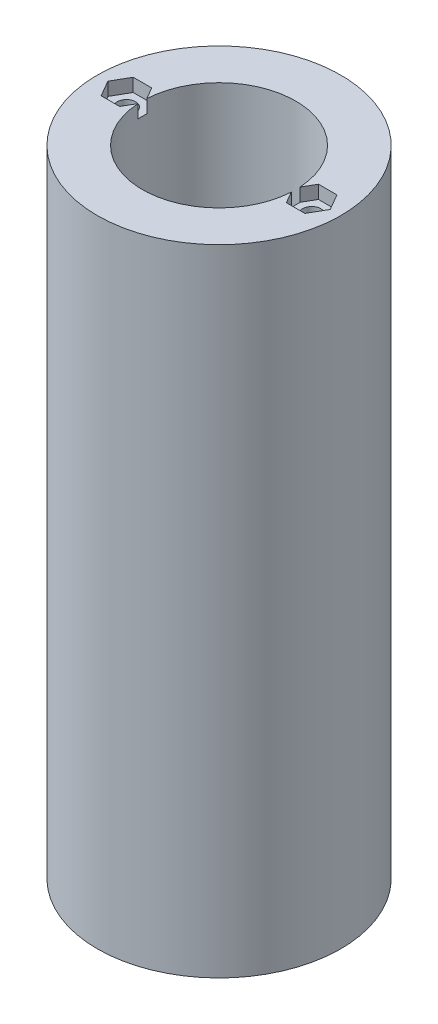
ISO-10303-21;
HEADER;
FILE_DESCRIPTION(('STEP AP214'),'2;1');
FILE_NAME('part.step','',(''),(''),'','','');
FILE_SCHEMA(('AUTOMOTIVE_DESIGN { 1 0 10303 214 1 1 1 1 }'));
ENDSEC;
DATA;
#1=APPLICATION_CONTEXT('core data for automotive mechanical design processes');
#2=APPLICATION_PROTOCOL_DEFINITION('international standard','automotive_design',2000,#1);
#3=PRODUCT_CONTEXT('',#1,'mechanical');
#4=PRODUCT('Part','Part','',(#3));
#5=PRODUCT_RELATED_PRODUCT_CATEGORY('part','',(#4));
#6=PRODUCT_DEFINITION_FORMATION('','',#4);
#7=PRODUCT_DEFINITION_CONTEXT('part definition',#1,'design');
#8=PRODUCT_DEFINITION('design','',#6,#7);
#9=PRODUCT_DEFINITION_SHAPE('','',#8);
#10=(LENGTH_UNIT() NAMED_UNIT(*) SI_UNIT(.MILLI.,.METRE.));
#11=(NAMED_UNIT(*) PLANE_ANGLE_UNIT() SI_UNIT($,.RADIAN.));
#12=(NAMED_UNIT(*) SI_UNIT($,.STERADIAN.) SOLID_ANGLE_UNIT());
#13=UNCERTAINTY_MEASURE_WITH_UNIT(LENGTH_MEASURE(1.E-05),#10,'distance_accuracy_value','');
#14=(GEOMETRIC_REPRESENTATION_CONTEXT(3) GLOBAL_UNCERTAINTY_ASSIGNED_CONTEXT((#13)) GLOBAL_UNIT_ASSIGNED_CONTEXT((#10,
#11,#12)) REPRESENTATION_CONTEXT('',''));
#15=CARTESIAN_POINT('',(0.,0.,0.));
#16=DIRECTION('',(0.,0.,1.));
#17=DIRECTION('',(1.,0.,0.));
#18=AXIS2_PLACEMENT_3D('',#15,#16,#17);
#19=CARTESIAN_POINT('',(0.,0.,0.));
#20=DIRECTION('',(0.,1.,0.));
#21=DIRECTION('',(0.,0.,1.));
#22=AXIS2_PLACEMENT_3D('',#19,#20,#21);
#23=CYLINDRICAL_SURFACE('',#22,14.5);
#24=CARTESIAN_POINT('',(0.,117.5,0.));
#25=DIRECTION('',(0.,1.,0.));
#26=DIRECTION('',(0.,0.,1.));
#27=AXIS2_PLACEMENT_3D('',#24,#25,#26);
#28=CIRCLE('',#27,14.5);
#29=CARTESIAN_POINT('',(14.4764934301467,117.5,-0.825310830486886));
#30=VERTEX_POINT('',#29);
#31=CARTESIAN_POINT('',(14.4764934301467,117.5,0.825310830486886));
#32=VERTEX_POINT('',#31);
#33=EDGE_CURVE('E142',#30,#32,#28,.F.);
#34=ORIENTED_EDGE('',*,*,#33,.F.);
#35=DIRECTION('',(0.,1.,0.));
#36=VECTOR('',#35,1.);
#37=CARTESIAN_POINT('',(14.4764934301467,0.,-0.825310830486886));
#38=LINE('',#37,#36);
#39=CARTESIAN_POINT('',(14.4764934301467,120.,-0.825310830486886));
#40=VERTEX_POINT('',#39);
#41=EDGE_CURVE('E41',#30,#40,#38,.T.);
#42=ORIENTED_EDGE('',*,*,#41,.T.);
#43=CARTESIAN_POINT('',(0.,120.,0.));
#44=DIRECTION('',(0.,1.,0.));
#45=DIRECTION('',(0.,0.,1.));
#46=AXIS2_PLACEMENT_3D('',#43,#44,#45);
#47=CIRCLE('',#46,14.5);
#48=CARTESIAN_POINT('',(-14.4764934301467,120.,-0.825310830486886));
#49=VERTEX_POINT('',#48);
#50=EDGE_CURVE('E223',#40,#49,#47,.T.);
#51=ORIENTED_EDGE('',*,*,#50,.T.);
#52=DIRECTION('',(0.,1.,0.));
#53=VECTOR('',#52,1.);
#54=CARTESIAN_POINT('',(-14.4764934301467,0.,-0.825310830486886));
#55=LINE('',#54,#53);
#56=CARTESIAN_POINT('',(-14.4764934301467,117.5,-0.825310830486886));
#57=VERTEX_POINT('',#56);
#58=EDGE_CURVE('E247',#49,#57,#55,.F.);
#59=ORIENTED_EDGE('',*,*,#58,.T.);
#60=CARTESIAN_POINT('',(0.,117.5,0.));
#61=DIRECTION('',(0.,-1.,0.));
#62=DIRECTION('',(0.,0.,-1.));
#63=AXIS2_PLACEMENT_3D('',#60,#61,#62);
#64=CIRCLE('',#63,14.5);
#65=CARTESIAN_POINT('',(-14.4764934301467,117.5,0.825310830486886));
#66=VERTEX_POINT('',#65);
#67=EDGE_CURVE('E239',#57,#66,#64,.F.);
#68=ORIENTED_EDGE('',*,*,#67,.T.);
#69=DIRECTION('',(0.,1.,0.));
#70=VECTOR('',#69,1.);
#71=CARTESIAN_POINT('',(-14.4764934301467,0.,0.825310830486889));
#72=LINE('',#71,#70);
#73=CARTESIAN_POINT('',(-14.4764934301467,120.,0.825310830486886));
#74=VERTEX_POINT('',#73);
#75=EDGE_CURVE('E244',#66,#74,#72,.T.);
#76=ORIENTED_EDGE('',*,*,#75,.T.);
#77=CARTESIAN_POINT('',(14.4764934301467,120.,0.825310830486886));
#78=VERTEX_POINT('',#77);
#79=EDGE_CURVE('E232',#74,#78,#47,.T.);
#80=ORIENTED_EDGE('',*,*,#79,.T.);
#81=DIRECTION('',(0.,1.,0.));
#82=VECTOR('',#81,1.);
#83=CARTESIAN_POINT('',(14.4764934301467,0.,0.825310830486889));
#84=LINE('',#83,#82);
#85=EDGE_CURVE('E251',#78,#32,#84,.F.);
#86=ORIENTED_EDGE('',*,*,#85,.T.);
#87=EDGE_LOOP('',(#34,#42,#51,#59,#68,#76,#80,#86));
#88=FACE_BOUND('',#87,.T.);
#89=CARTESIAN_POINT('',(0.,5.,0.));
#90=DIRECTION('',(0.,-1.,0.));
#91=DIRECTION('',(0.,0.,-1.));
#92=AXIS2_PLACEMENT_3D('',#89,#90,#91);
#93=CIRCLE('',#92,14.5);
#94=CARTESIAN_POINT('',(0.,5.,-14.5));
#95=VERTEX_POINT('',#94);
#96=EDGE_CURVE('E11',#95,#95,#93,.F.);
#97=ORIENTED_EDGE('',*,*,#96,.F.);
#98=EDGE_LOOP('',(#97));
#99=FACE_BOUND('',#98,.T.);
#100=ADVANCED_FACE('F33',(#88,#99),#23,.F.);
#101=CARTESIAN_POINT('',(0.,120.,0.));
#102=DIRECTION('',(0.,-1.,0.));
#103=DIRECTION('',(0.,0.,-1.));
#104=AXIS2_PLACEMENT_3D('',#101,#102,#103);
#105=CYLINDRICAL_SURFACE('',#104,23.);
#106=CARTESIAN_POINT('',(0.,120.,0.));
#107=DIRECTION('',(0.,1.,0.));
#108=DIRECTION('',(0.,0.,1.));
#109=AXIS2_PLACEMENT_3D('',#106,#107,#108);
#110=CIRCLE('',#109,23.);
#111=CARTESIAN_POINT('',(0.,120.,23.));
#112=VERTEX_POINT('',#111);
#113=EDGE_CURVE('E236',#112,#112,#110,.T.);
#114=ORIENTED_EDGE('',*,*,#113,.F.);
#115=EDGE_LOOP('',(#114));
#116=FACE_BOUND('',#115,.T.);
#117=CARTESIAN_POINT('',(0.,0.,0.));
#118=DIRECTION('',(0.,1.,0.));
#119=DIRECTION('',(0.,0.,1.));
#120=AXIS2_PLACEMENT_3D('',#117,#118,#119);
#121=CIRCLE('',#120,23.);
#122=CARTESIAN_POINT('',(0.,0.,23.));
#123=VERTEX_POINT('',#122);
#124=EDGE_CURVE('E235',#123,#123,#121,.T.);
#125=ORIENTED_EDGE('',*,*,#124,.T.);
#126=EDGE_LOOP('',(#125));
#127=FACE_BOUND('',#126,.T.);
#128=ADVANCED_FACE('F35',(#116,#127),#105,.T.);
#129=CARTESIAN_POINT('',(0.,120.,0.));
#130=DIRECTION('',(0.,1.,0.));
#131=DIRECTION('',(0.,0.,1.));
#132=AXIS2_PLACEMENT_3D('',#129,#130,#131);
#133=PLANE('',#132);
#134=DIRECTION('',(-0.499999999999998,0.,0.86602540378444));
#135=VECTOR('',#134,1.);
#136=CARTESIAN_POINT('',(15.75,120.,-3.03108891324553));
#137=LINE('',#136,#135);
#138=CARTESIAN_POINT('',(15.75,120.,-3.03108891324553));
#139=VERTEX_POINT('',#138);
#140=EDGE_CURVE('E168',#139,#40,#137,.T.);
#141=ORIENTED_EDGE('',*,*,#140,.F.);
#142=DIRECTION('',(-1.,0.,0.));
#143=VECTOR('',#142,1.);
#144=CARTESIAN_POINT('',(19.25,120.,-3.03108891324554));
#145=LINE('',#144,#143);
#146=CARTESIAN_POINT('',(19.25,120.,-3.03108891324554));
#147=VERTEX_POINT('',#146);
#148=EDGE_CURVE('E180',#147,#139,#145,.T.);
#149=ORIENTED_EDGE('',*,*,#148,.F.);
#150=DIRECTION('',(-0.500000000000001,0.,-0.866025403784438));
#151=VECTOR('',#150,1.);
#152=CARTESIAN_POINT('',(19.25,120.,-3.03108891324554));
#153=LINE('',#152,#151);
#154=CARTESIAN_POINT('',(21.,120.,0.));
#155=VERTEX_POINT('',#154);
#156=EDGE_CURVE('E177',#155,#147,#153,.T.);
#157=ORIENTED_EDGE('',*,*,#156,.F.);
#158=DIRECTION('',(0.500000000000001,0.,-0.866025403784438));
#159=VECTOR('',#158,1.);
#160=CARTESIAN_POINT('',(21.,120.,0.));
#161=LINE('',#160,#159);
#162=CARTESIAN_POINT('',(19.25,120.,3.03108891324554));
#163=VERTEX_POINT('',#162);
#164=EDGE_CURVE('E174',#163,#155,#161,.T.);
#165=ORIENTED_EDGE('',*,*,#164,.F.);
#166=DIRECTION('',(1.,0.,0.));
#167=VECTOR('',#166,1.);
#168=CARTESIAN_POINT('',(19.25,120.,3.03108891324554));
#169=LINE('',#168,#167);
#170=CARTESIAN_POINT('',(15.75,120.,3.03108891324553));
#171=VERTEX_POINT('',#170);
#172=EDGE_CURVE('E172',#171,#163,#169,.T.);
#173=ORIENTED_EDGE('',*,*,#172,.F.);
#174=DIRECTION('',(0.499999999999998,0.,0.86602540378444));
#175=VECTOR('',#174,1.);
#176=CARTESIAN_POINT('',(14.,120.,0.));
#177=LINE('',#176,#175);
#178=EDGE_CURVE('E150',#78,#171,#177,.T.);
#179=ORIENTED_EDGE('',*,*,#178,.F.);
#180=ORIENTED_EDGE('',*,*,#79,.F.);
#181=DIRECTION('',(0.499999999999998,0.,-0.86602540378444));
#182=VECTOR('',#181,1.);
#183=CARTESIAN_POINT('',(-14.,120.,0.));
#184=LINE('',#183,#182);
#185=CARTESIAN_POINT('',(-15.75,120.,3.03108891324553));
#186=VERTEX_POINT('',#185);
#187=EDGE_CURVE('E194',#186,#74,#184,.T.);
#188=ORIENTED_EDGE('',*,*,#187,.F.);
#189=DIRECTION('',(1.,0.,0.));
#190=VECTOR('',#189,1.);
#191=CARTESIAN_POINT('',(-19.25,120.,3.03108891324554));
#192=LINE('',#191,#190);
#193=CARTESIAN_POINT('',(-19.25,120.,3.03108891324554));
#194=VERTEX_POINT('',#193);
#195=EDGE_CURVE('E217',#194,#186,#192,.T.);
#196=ORIENTED_EDGE('',*,*,#195,.F.);
#197=DIRECTION('',(0.500000000000001,0.,0.866025403784438));
#198=VECTOR('',#197,1.);
#199=CARTESIAN_POINT('',(-21.,120.,0.));
#200=LINE('',#199,#198);
#201=CARTESIAN_POINT('',(-21.,120.,0.));
#202=VERTEX_POINT('',#201);
#203=EDGE_CURVE('E214',#202,#194,#200,.T.);
#204=ORIENTED_EDGE('',*,*,#203,.F.);
#205=DIRECTION('',(-0.500000000000001,0.,0.866025403784438));
#206=VECTOR('',#205,1.);
#207=CARTESIAN_POINT('',(-19.25,120.,-3.03108891324554));
#208=LINE('',#207,#206);
#209=CARTESIAN_POINT('',(-19.25,120.,-3.03108891324554));
#210=VERTEX_POINT('',#209);
#211=EDGE_CURVE('E211',#210,#202,#208,.T.);
#212=ORIENTED_EDGE('',*,*,#211,.F.);
#213=DIRECTION('',(-1.,0.,0.));
#214=VECTOR('',#213,1.);
#215=CARTESIAN_POINT('',(-19.25,120.,-3.03108891324554));
#216=LINE('',#215,#214);
#217=CARTESIAN_POINT('',(-15.75,120.,-3.03108891324553));
#218=VERTEX_POINT('',#217);
#219=EDGE_CURVE('E208',#218,#210,#216,.T.);
#220=ORIENTED_EDGE('',*,*,#219,.F.);
#221=DIRECTION('',(-0.499999999999998,0.,-0.86602540378444));
#222=VECTOR('',#221,1.);
#223=CARTESIAN_POINT('',(-15.75,120.,-3.03108891324553));
#224=LINE('',#223,#222);
#225=EDGE_CURVE('E185',#49,#218,#224,.T.);
#226=ORIENTED_EDGE('',*,*,#225,.F.);
#227=ORIENTED_EDGE('',*,*,#50,.F.);
#228=EDGE_LOOP('',(#141,#149,#157,#165,#173,#179,#180,#188,#196,#204,#212,#220,#226,#227));
#229=FACE_BOUND('',#228,.T.);
#230=ORIENTED_EDGE('',*,*,#113,.T.);
#231=EDGE_LOOP('',(#230));
#232=FACE_BOUND('',#231,.T.);
#233=ADVANCED_FACE('F261',(#229,#232),#133,.T.);
#234=CARTESIAN_POINT('',(0.,0.,0.));
#235=DIRECTION('',(0.,1.,0.));
#236=DIRECTION('',(0.,0.,1.));
#237=AXIS2_PLACEMENT_3D('',#234,#235,#236);
#238=PLANE('',#237);
#239=CARTESIAN_POINT('',(0.,0.,0.));
#240=DIRECTION('',(0.,-1.,0.));
#241=DIRECTION('',(0.,0.,-1.));
#242=AXIS2_PLACEMENT_3D('',#239,#240,#241);
#243=CIRCLE('',#242,4.);
#244=CARTESIAN_POINT('',(0.,0.,-4.));
#245=VERTEX_POINT('',#244);
#246=EDGE_CURVE('E302',#245,#245,#243,.T.);
#247=ORIENTED_EDGE('',*,*,#246,.F.);
#248=EDGE_LOOP('',(#247));
#249=FACE_BOUND('',#248,.T.);
#250=ORIENTED_EDGE('',*,*,#124,.F.);
#251=EDGE_LOOP('',(#250));
#252=FACE_BOUND('',#251,.T.);
#253=ADVANCED_FACE('F317',(#249,#252),#238,.F.);
#254=CARTESIAN_POINT('',(-15.75,117.5,-3.03108891324553));
#255=DIRECTION('',(0.86602540378444,0.,-0.499999999999998));
#256=DIRECTION('',(-0.499999999999998,0.,-0.86602540378444));
#257=AXIS2_PLACEMENT_3D('',#254,#255,#256);
#258=PLANE('',#257);
#259=ORIENTED_EDGE('',*,*,#225,.T.);
#260=DIRECTION('',(0.,1.,0.));
#261=VECTOR('',#260,1.);
#262=CARTESIAN_POINT('',(-15.75,117.5,-3.03108891324553));
#263=LINE('',#262,#261);
#264=CARTESIAN_POINT('',(-15.75,117.5,-3.03108891324553));
#265=VERTEX_POINT('',#264);
#266=EDGE_CURVE('E206',#265,#218,#263,.T.);
#267=ORIENTED_EDGE('',*,*,#266,.F.);
#268=DIRECTION('',(-0.499999999999998,0.,-0.86602540378444));
#269=VECTOR('',#268,1.);
#270=CARTESIAN_POINT('',(-15.75,117.5,-3.03108891324553));
#271=LINE('',#270,#269);
#272=EDGE_CURVE('E191',#57,#265,#271,.T.);
#273=ORIENTED_EDGE('',*,*,#272,.F.);
#274=ORIENTED_EDGE('',*,*,#58,.F.);
#275=EDGE_LOOP('',(#259,#267,#273,#274));
#276=FACE_BOUND('',#275,.T.);
#277=ADVANCED_FACE('F268',(#276),#258,.F.);
#278=CARTESIAN_POINT('',(-14.,117.5,0.));
#279=DIRECTION('',(0.86602540378444,0.,0.499999999999998));
#280=DIRECTION('',(0.499999999999998,0.,-0.86602540378444));
#281=AXIS2_PLACEMENT_3D('',#278,#279,#280);
#282=PLANE('',#281);
#283=DIRECTION('',(0.499999999999998,0.,-0.86602540378444));
#284=VECTOR('',#283,1.);
#285=CARTESIAN_POINT('',(-14.,117.5,0.));
#286=LINE('',#285,#284);
#287=CARTESIAN_POINT('',(-15.75,117.5,3.03108891324553));
#288=VERTEX_POINT('',#287);
#289=EDGE_CURVE('E56',#288,#66,#286,.T.);
#290=ORIENTED_EDGE('',*,*,#289,.F.);
#291=DIRECTION('',(0.,1.,0.));
#292=VECTOR('',#291,1.);
#293=CARTESIAN_POINT('',(-15.75,117.5,3.03108891324553));
#294=LINE('',#293,#292);
#295=EDGE_CURVE('E221',#288,#186,#294,.T.);
#296=ORIENTED_EDGE('',*,*,#295,.T.);
#297=ORIENTED_EDGE('',*,*,#187,.T.);
#298=ORIENTED_EDGE('',*,*,#75,.F.);
#299=EDGE_LOOP('',(#290,#296,#297,#298));
#300=FACE_BOUND('',#299,.T.);
#301=ADVANCED_FACE('F336',(#300),#282,.F.);
#302=CARTESIAN_POINT('',(0.,117.5,0.));
#303=DIRECTION('',(0.,-1.,0.));
#304=DIRECTION('',(0.,0.,-1.));
#305=AXIS2_PLACEMENT_3D('',#302,#303,#304);
#306=PLANE('',#305);
#307=CARTESIAN_POINT('',(-17.5,117.5,0.));
#308=DIRECTION('',(0.,1.,0.));
#309=DIRECTION('',(0.,0.,1.));
#310=AXIS2_PLACEMENT_3D('',#307,#308,#309);
#311=CIRCLE('',#310,1.75);
#312=CARTESIAN_POINT('',(-17.5,117.5,1.74999999999999));
#313=VERTEX_POINT('',#312);
#314=EDGE_CURVE('E290',#313,#313,#311,.T.);
#315=ORIENTED_EDGE('',*,*,#314,.F.);
#316=EDGE_LOOP('',(#315));
#317=FACE_BOUND('',#316,.T.);
#318=ORIENTED_EDGE('',*,*,#272,.T.);
#319=DIRECTION('',(-1.,0.,0.));
#320=VECTOR('',#319,1.);
#321=CARTESIAN_POINT('',(-19.25,117.5,-3.03108891324554));
#322=LINE('',#321,#320);
#323=CARTESIAN_POINT('',(-19.25,117.5,-3.03108891324554));
#324=VERTEX_POINT('',#323);
#325=EDGE_CURVE('E193',#265,#324,#322,.T.);
#326=ORIENTED_EDGE('',*,*,#325,.T.);
#327=DIRECTION('',(-0.500000000000001,0.,0.866025403784438));
#328=VECTOR('',#327,1.);
#329=CARTESIAN_POINT('',(-19.25,117.5,-3.03108891324554));
#330=LINE('',#329,#328);
#331=CARTESIAN_POINT('',(-21.,117.5,0.));
#332=VERTEX_POINT('',#331);
#333=EDGE_CURVE('E197',#324,#332,#330,.T.);
#334=ORIENTED_EDGE('',*,*,#333,.T.);
#335=DIRECTION('',(0.500000000000001,0.,0.866025403784438));
#336=VECTOR('',#335,1.);
#337=CARTESIAN_POINT('',(-21.,117.5,0.));
#338=LINE('',#337,#336);
#339=CARTESIAN_POINT('',(-19.25,117.5,3.03108891324554));
#340=VERTEX_POINT('',#339);
#341=EDGE_CURVE('E200',#332,#340,#338,.T.);
#342=ORIENTED_EDGE('',*,*,#341,.T.);
#343=DIRECTION('',(1.,0.,0.));
#344=VECTOR('',#343,1.);
#345=CARTESIAN_POINT('',(-19.25,117.5,3.03108891324554));
#346=LINE('',#345,#344);
#347=EDGE_CURVE('E203',#340,#288,#346,.T.);
#348=ORIENTED_EDGE('',*,*,#347,.T.);
#349=ORIENTED_EDGE('',*,*,#289,.T.);
#350=ORIENTED_EDGE('',*,*,#67,.F.);
#351=EDGE_LOOP('',(#318,#326,#334,#342,#348,#349,#350));
#352=FACE_BOUND('',#351,.T.);
#353=ADVANCED_FACE('F274',(#317,#352),#306,.F.);
#354=CARTESIAN_POINT('',(-19.25,117.5,3.03108891324554));
#355=DIRECTION('',(0.,0.,1.));
#356=DIRECTION('',(1.,0.,0.));
#357=AXIS2_PLACEMENT_3D('',#354,#355,#356);
#358=PLANE('',#357);
#359=ORIENTED_EDGE('',*,*,#195,.T.);
#360=ORIENTED_EDGE('',*,*,#295,.F.);
#361=ORIENTED_EDGE('',*,*,#347,.F.);
#362=DIRECTION('',(0.,1.,0.));
#363=VECTOR('',#362,1.);
#364=CARTESIAN_POINT('',(-19.25,117.5,3.03108891324554));
#365=LINE('',#364,#363);
#366=EDGE_CURVE('E224',#340,#194,#365,.T.);
#367=ORIENTED_EDGE('',*,*,#366,.T.);
#368=EDGE_LOOP('',(#359,#360,#361,#367));
#369=FACE_BOUND('',#368,.T.);
#370=ADVANCED_FACE('F346',(#369),#358,.F.);
#371=CARTESIAN_POINT('',(-21.,117.5,0.));
#372=DIRECTION('',(-0.866025403784438,0.,0.500000000000001));
#373=DIRECTION('',(0.500000000000001,0.,0.866025403784438));
#374=AXIS2_PLACEMENT_3D('',#371,#372,#373);
#375=PLANE('',#374);
#376=ORIENTED_EDGE('',*,*,#203,.T.);
#377=ORIENTED_EDGE('',*,*,#366,.F.);
#378=ORIENTED_EDGE('',*,*,#341,.F.);
#379=DIRECTION('',(0.,1.,0.));
#380=VECTOR('',#379,1.);
#381=CARTESIAN_POINT('',(-21.,117.5,0.));
#382=LINE('',#381,#380);
#383=EDGE_CURVE('E226',#332,#202,#382,.T.);
#384=ORIENTED_EDGE('',*,*,#383,.T.);
#385=EDGE_LOOP('',(#376,#377,#378,#384));
#386=FACE_BOUND('',#385,.T.);
#387=ADVANCED_FACE('F342',(#386),#375,.F.);
#388=CARTESIAN_POINT('',(-19.25,117.5,-3.03108891324554));
#389=DIRECTION('',(-0.866025403784438,0.,-0.500000000000001));
#390=DIRECTION('',(-0.500000000000001,0.,0.866025403784438));
#391=AXIS2_PLACEMENT_3D('',#388,#389,#390);
#392=PLANE('',#391);
#393=ORIENTED_EDGE('',*,*,#211,.T.);
#394=ORIENTED_EDGE('',*,*,#383,.F.);
#395=ORIENTED_EDGE('',*,*,#333,.F.);
#396=DIRECTION('',(0.,1.,0.));
#397=VECTOR('',#396,1.);
#398=CARTESIAN_POINT('',(-19.25,117.5,-3.03108891324554));
#399=LINE('',#398,#397);
#400=EDGE_CURVE('E228',#324,#210,#399,.T.);
#401=ORIENTED_EDGE('',*,*,#400,.T.);
#402=EDGE_LOOP('',(#393,#394,#395,#401));
#403=FACE_BOUND('',#402,.T.);
#404=ADVANCED_FACE('F339',(#403),#392,.F.);
#405=CARTESIAN_POINT('',(-19.25,117.5,-3.03108891324554));
#406=DIRECTION('',(0.,0.,-1.));
#407=DIRECTION('',(-1.,0.,0.));
#408=AXIS2_PLACEMENT_3D('',#405,#406,#407);
#409=PLANE('',#408);
#410=ORIENTED_EDGE('',*,*,#219,.T.);
#411=ORIENTED_EDGE('',*,*,#400,.F.);
#412=ORIENTED_EDGE('',*,*,#325,.F.);
#413=ORIENTED_EDGE('',*,*,#266,.T.);
#414=EDGE_LOOP('',(#410,#411,#412,#413));
#415=FACE_BOUND('',#414,.T.);
#416=ADVANCED_FACE('F272',(#415),#409,.F.);
#417=CARTESIAN_POINT('',(15.75,117.5,-3.03108891324553));
#418=DIRECTION('',(-0.86602540378444,0.,-0.499999999999998));
#419=DIRECTION('',(-0.499999999999998,0.,0.86602540378444));
#420=AXIS2_PLACEMENT_3D('',#417,#418,#419);
#421=PLANE('',#420);
#422=DIRECTION('',(-0.499999999999998,0.,0.86602540378444));
#423=VECTOR('',#422,1.);
#424=CARTESIAN_POINT('',(15.75,117.5,-3.03108891324553));
#425=LINE('',#424,#423);
#426=CARTESIAN_POINT('',(15.75,117.5,-3.03108891324553));
#427=VERTEX_POINT('',#426);
#428=EDGE_CURVE('E48',#427,#30,#425,.T.);
#429=ORIENTED_EDGE('',*,*,#428,.F.);
#430=DIRECTION('',(0.,1.,0.));
#431=VECTOR('',#430,1.);
#432=CARTESIAN_POINT('',(15.75,117.5,-3.03108891324553));
#433=LINE('',#432,#431);
#434=EDGE_CURVE('E183',#427,#139,#433,.T.);
#435=ORIENTED_EDGE('',*,*,#434,.T.);
#436=ORIENTED_EDGE('',*,*,#140,.T.);
#437=ORIENTED_EDGE('',*,*,#41,.F.);
#438=EDGE_LOOP('',(#429,#435,#436,#437));
#439=FACE_BOUND('',#438,.T.);
#440=ADVANCED_FACE('F288',(#439),#421,.F.);
#441=CARTESIAN_POINT('',(14.,117.5,0.));
#442=DIRECTION('',(-0.86602540378444,0.,0.499999999999998));
#443=DIRECTION('',(0.499999999999998,0.,0.86602540378444));
#444=AXIS2_PLACEMENT_3D('',#441,#442,#443);
#445=PLANE('',#444);
#446=ORIENTED_EDGE('',*,*,#178,.T.);
#447=DIRECTION('',(0.,1.,0.));
#448=VECTOR('',#447,1.);
#449=CARTESIAN_POINT('',(15.75,117.5,3.03108891324553));
#450=LINE('',#449,#448);
#451=CARTESIAN_POINT('',(15.75,117.5,3.03108891324553));
#452=VERTEX_POINT('',#451);
#453=EDGE_CURVE('E147',#452,#171,#450,.T.);
#454=ORIENTED_EDGE('',*,*,#453,.F.);
#455=DIRECTION('',(0.499999999999998,0.,0.86602540378444));
#456=VECTOR('',#455,1.);
#457=CARTESIAN_POINT('',(14.,117.5,0.));
#458=LINE('',#457,#456);
#459=EDGE_CURVE('E135',#32,#452,#458,.T.);
#460=ORIENTED_EDGE('',*,*,#459,.F.);
#461=ORIENTED_EDGE('',*,*,#85,.F.);
#462=EDGE_LOOP('',(#446,#454,#460,#461));
#463=FACE_BOUND('',#462,.T.);
#464=ADVANCED_FACE('F148',(#463),#445,.F.);
#465=CARTESIAN_POINT('',(0.,117.5,0.));
#466=DIRECTION('',(0.,1.,0.));
#467=DIRECTION('',(0.,0.,1.));
#468=AXIS2_PLACEMENT_3D('',#465,#466,#467);
#469=PLANE('',#468);
#470=CARTESIAN_POINT('',(17.5,117.5,0.));
#471=DIRECTION('',(0.,1.,0.));
#472=DIRECTION('',(0.,0.,-1.));
#473=AXIS2_PLACEMENT_3D('',#470,#471,#472);
#474=CIRCLE('',#473,1.75);
#475=CARTESIAN_POINT('',(17.5,117.5,-1.75000000000001));
#476=VERTEX_POINT('',#475);
#477=EDGE_CURVE('E296',#476,#476,#474,.T.);
#478=ORIENTED_EDGE('',*,*,#477,.F.);
#479=EDGE_LOOP('',(#478));
#480=FACE_BOUND('',#479,.T.);
#481=ORIENTED_EDGE('',*,*,#33,.T.);
#482=ORIENTED_EDGE('',*,*,#459,.T.);
#483=DIRECTION('',(1.,0.,0.));
#484=VECTOR('',#483,1.);
#485=CARTESIAN_POINT('',(19.25,117.5,3.03108891324554));
#486=LINE('',#485,#484);
#487=CARTESIAN_POINT('',(19.25,117.5,3.03108891324554));
#488=VERTEX_POINT('',#487);
#489=EDGE_CURVE('E140',#452,#488,#486,.T.);
#490=ORIENTED_EDGE('',*,*,#489,.T.);
#491=DIRECTION('',(0.500000000000001,0.,-0.866025403784438));
#492=VECTOR('',#491,1.);
#493=CARTESIAN_POINT('',(21.,117.5,0.));
#494=LINE('',#493,#492);
#495=CARTESIAN_POINT('',(21.,117.5,0.));
#496=VERTEX_POINT('',#495);
#497=EDGE_CURVE('E159',#488,#496,#494,.T.);
#498=ORIENTED_EDGE('',*,*,#497,.T.);
#499=DIRECTION('',(-0.500000000000001,0.,-0.866025403784438));
#500=VECTOR('',#499,1.);
#501=CARTESIAN_POINT('',(19.25,117.5,-3.03108891324554));
#502=LINE('',#501,#500);
#503=CARTESIAN_POINT('',(19.25,117.5,-3.03108891324554));
#504=VERTEX_POINT('',#503);
#505=EDGE_CURVE('E161',#496,#504,#502,.T.);
#506=ORIENTED_EDGE('',*,*,#505,.T.);
#507=DIRECTION('',(-1.,0.,0.));
#508=VECTOR('',#507,1.);
#509=CARTESIAN_POINT('',(19.25,117.5,-3.03108891324554));
#510=LINE('',#509,#508);
#511=EDGE_CURVE('E155',#504,#427,#510,.T.);
#512=ORIENTED_EDGE('',*,*,#511,.T.);
#513=ORIENTED_EDGE('',*,*,#428,.T.);
#514=EDGE_LOOP('',(#481,#482,#490,#498,#506,#512,#513));
#515=FACE_BOUND('',#514,.T.);
#516=ADVANCED_FACE('F137',(#480,#515),#469,.T.);
#517=CARTESIAN_POINT('',(19.25,117.5,-3.03108891324554));
#518=DIRECTION('',(0.,0.,-1.));
#519=DIRECTION('',(-1.,0.,0.));
#520=AXIS2_PLACEMENT_3D('',#517,#518,#519);
#521=PLANE('',#520);
#522=ORIENTED_EDGE('',*,*,#148,.T.);
#523=ORIENTED_EDGE('',*,*,#434,.F.);
#524=ORIENTED_EDGE('',*,*,#511,.F.);
#525=DIRECTION('',(0.,1.,0.));
#526=VECTOR('',#525,1.);
#527=CARTESIAN_POINT('',(19.25,117.5,-3.03108891324554));
#528=LINE('',#527,#526);
#529=EDGE_CURVE('E186',#504,#147,#528,.T.);
#530=ORIENTED_EDGE('',*,*,#529,.T.);
#531=EDGE_LOOP('',(#522,#523,#524,#530));
#532=FACE_BOUND('',#531,.T.);
#533=ADVANCED_FACE('F287',(#532),#521,.F.);
#534=CARTESIAN_POINT('',(19.25,117.5,-3.03108891324554));
#535=DIRECTION('',(0.866025403784438,0.,-0.500000000000001));
#536=DIRECTION('',(-0.500000000000001,0.,-0.866025403784438));
#537=AXIS2_PLACEMENT_3D('',#534,#535,#536);
#538=PLANE('',#537);
#539=ORIENTED_EDGE('',*,*,#156,.T.);
#540=ORIENTED_EDGE('',*,*,#529,.F.);
#541=ORIENTED_EDGE('',*,*,#505,.F.);
#542=DIRECTION('',(0.,1.,0.));
#543=VECTOR('',#542,1.);
#544=CARTESIAN_POINT('',(21.,117.5,0.));
#545=LINE('',#544,#543);
#546=EDGE_CURVE('E188',#496,#155,#545,.T.);
#547=ORIENTED_EDGE('',*,*,#546,.T.);
#548=EDGE_LOOP('',(#539,#540,#541,#547));
#549=FACE_BOUND('',#548,.T.);
#550=ADVANCED_FACE('F365',(#549),#538,.F.);
#551=CARTESIAN_POINT('',(21.,117.5,0.));
#552=DIRECTION('',(0.866025403784438,0.,0.500000000000001));
#553=DIRECTION('',(0.500000000000001,0.,-0.866025403784438));
#554=AXIS2_PLACEMENT_3D('',#551,#552,#553);
#555=PLANE('',#554);
#556=ORIENTED_EDGE('',*,*,#164,.T.);
#557=ORIENTED_EDGE('',*,*,#546,.F.);
#558=ORIENTED_EDGE('',*,*,#497,.F.);
#559=DIRECTION('',(0.,1.,0.));
#560=VECTOR('',#559,1.);
#561=CARTESIAN_POINT('',(19.25,117.5,3.03108891324554));
#562=LINE('',#561,#560);
#563=EDGE_CURVE('E154',#488,#163,#562,.T.);
#564=ORIENTED_EDGE('',*,*,#563,.T.);
#565=EDGE_LOOP('',(#556,#557,#558,#564));
#566=FACE_BOUND('',#565,.T.);
#567=ADVANCED_FACE('F282',(#566),#555,.F.);
#568=CARTESIAN_POINT('',(19.25,117.5,3.03108891324554));
#569=DIRECTION('',(0.,0.,1.));
#570=DIRECTION('',(1.,0.,0.));
#571=AXIS2_PLACEMENT_3D('',#568,#569,#570);
#572=PLANE('',#571);
#573=ORIENTED_EDGE('',*,*,#172,.T.);
#574=ORIENTED_EDGE('',*,*,#563,.F.);
#575=ORIENTED_EDGE('',*,*,#489,.F.);
#576=ORIENTED_EDGE('',*,*,#453,.T.);
#577=EDGE_LOOP('',(#573,#574,#575,#576));
#578=FACE_BOUND('',#577,.T.);
#579=ADVANCED_FACE('F157',(#578),#572,.F.);
#580=CARTESIAN_POINT('',(-17.5,107.5,0.));
#581=DIRECTION('',(0.,1.,0.));
#582=DIRECTION('',(0.,0.,1.));
#583=AXIS2_PLACEMENT_3D('',#580,#581,#582);
#584=CYLINDRICAL_SURFACE('',#583,1.75);
#585=CARTESIAN_POINT('',(-17.5,107.5,0.));
#586=DIRECTION('',(0.,1.,0.));
#587=DIRECTION('',(0.,0.,1.));
#588=AXIS2_PLACEMENT_3D('',#585,#586,#587);
#589=CIRCLE('',#588,1.75);
#590=CARTESIAN_POINT('',(-17.5,107.5,1.74999999999999));
#591=VERTEX_POINT('',#590);
#592=EDGE_CURVE('E170',#591,#591,#589,.T.);
#593=ORIENTED_EDGE('',*,*,#592,.F.);
#594=EDGE_LOOP('',(#593));
#595=FACE_BOUND('',#594,.T.);
#596=ORIENTED_EDGE('',*,*,#314,.T.);
#597=EDGE_LOOP('',(#596));
#598=FACE_BOUND('',#597,.T.);
#599=ADVANCED_FACE('F362',(#595,#598),#584,.F.);
#600=CARTESIAN_POINT('',(-17.5,107.5,0.));
#601=DIRECTION('',(0.,1.,0.));
#602=DIRECTION('',(0.,0.,1.));
#603=AXIS2_PLACEMENT_3D('',#600,#601,#602);
#604=PLANE('',#603);
#605=ORIENTED_EDGE('',*,*,#592,.T.);
#606=EDGE_LOOP('',(#605));
#607=FACE_BOUND('',#606,.T.);
#608=ADVANCED_FACE('F375',(#607),#604,.T.);
#609=CARTESIAN_POINT('',(17.5,107.5,0.));
#610=DIRECTION('',(0.,1.,0.));
#611=DIRECTION('',(0.,0.,1.));
#612=AXIS2_PLACEMENT_3D('',#609,#610,#611);
#613=CYLINDRICAL_SURFACE('',#612,1.75);
#614=CARTESIAN_POINT('',(17.5,107.5,0.));
#615=DIRECTION('',(0.,1.,0.));
#616=DIRECTION('',(0.,0.,-1.));
#617=AXIS2_PLACEMENT_3D('',#614,#615,#616);
#618=CIRCLE('',#617,1.75);
#619=CARTESIAN_POINT('',(17.5,107.5,-1.75000000000001));
#620=VERTEX_POINT('',#619);
#621=EDGE_CURVE('E293',#620,#620,#618,.T.);
#622=ORIENTED_EDGE('',*,*,#621,.F.);
#623=EDGE_LOOP('',(#622));
#624=FACE_BOUND('',#623,.T.);
#625=ORIENTED_EDGE('',*,*,#477,.T.);
#626=EDGE_LOOP('',(#625));
#627=FACE_BOUND('',#626,.T.);
#628=ADVANCED_FACE('F379',(#624,#627),#613,.F.);
#629=CARTESIAN_POINT('',(17.5,107.5,0.));
#630=DIRECTION('',(0.,-1.,0.));
#631=DIRECTION('',(0.,0.,-1.));
#632=AXIS2_PLACEMENT_3D('',#629,#630,#631);
#633=PLANE('',#632);
#634=ORIENTED_EDGE('',*,*,#621,.T.);
#635=EDGE_LOOP('',(#634));
#636=FACE_BOUND('',#635,.T.);
#637=ADVANCED_FACE('F383',(#636),#633,.F.);
#638=CARTESIAN_POINT('',(0.,5.,0.));
#639=DIRECTION('',(0.,-1.,0.));
#640=DIRECTION('',(0.,0.,-1.));
#641=AXIS2_PLACEMENT_3D('',#638,#639,#640);
#642=PLANE('',#641);
#643=CARTESIAN_POINT('',(0.,5.,0.));
#644=DIRECTION('',(0.,-1.,0.));
#645=DIRECTION('',(0.,0.,-1.));
#646=AXIS2_PLACEMENT_3D('',#643,#644,#645);
#647=CIRCLE('',#646,4.);
#648=CARTESIAN_POINT('',(0.,5.,-4.));
#649=VERTEX_POINT('',#648);
#650=EDGE_CURVE('E299',#649,#649,#647,.T.);
#651=ORIENTED_EDGE('',*,*,#650,.T.);
#652=EDGE_LOOP('',(#651));
#653=FACE_BOUND('',#652,.T.);
#654=ORIENTED_EDGE('',*,*,#96,.T.);
#655=EDGE_LOOP('',(#654));
#656=FACE_BOUND('',#655,.T.);
#657=ADVANCED_FACE('F308',(#653,#656),#642,.F.);
#658=CARTESIAN_POINT('',(0.,5.,0.));
#659=DIRECTION('',(0.,-1.,0.));
#660=DIRECTION('',(0.,0.,-1.));
#661=AXIS2_PLACEMENT_3D('',#658,#659,#660);
#662=CYLINDRICAL_SURFACE('',#661,4.);
#663=ORIENTED_EDGE('',*,*,#650,.F.);
#664=EDGE_LOOP('',(#663));
#665=FACE_BOUND('',#664,.T.);
#666=ORIENTED_EDGE('',*,*,#246,.T.);
#667=EDGE_LOOP('',(#666));
#668=FACE_BOUND('',#667,.T.);
#669=ADVANCED_FACE('F311',(#665,#668),#662,.F.);
#670=CLOSED_SHELL('',(#100,#128,#233,#253,#277,#301,#353,#370,#387,#404,#416,#440,#464,#516,
#533,#550,#567,#579,#599,#608,#628,#637,#657,#669));
#671=MANIFOLD_SOLID_BREP('B2',#670);
#672=ADVANCED_BREP_SHAPE_REPRESENTATION('',(#18,#671),#14);
#673=SHAPE_DEFINITION_REPRESENTATION(#9,#672);
ENDSEC;
END-ISO-10303-21;
